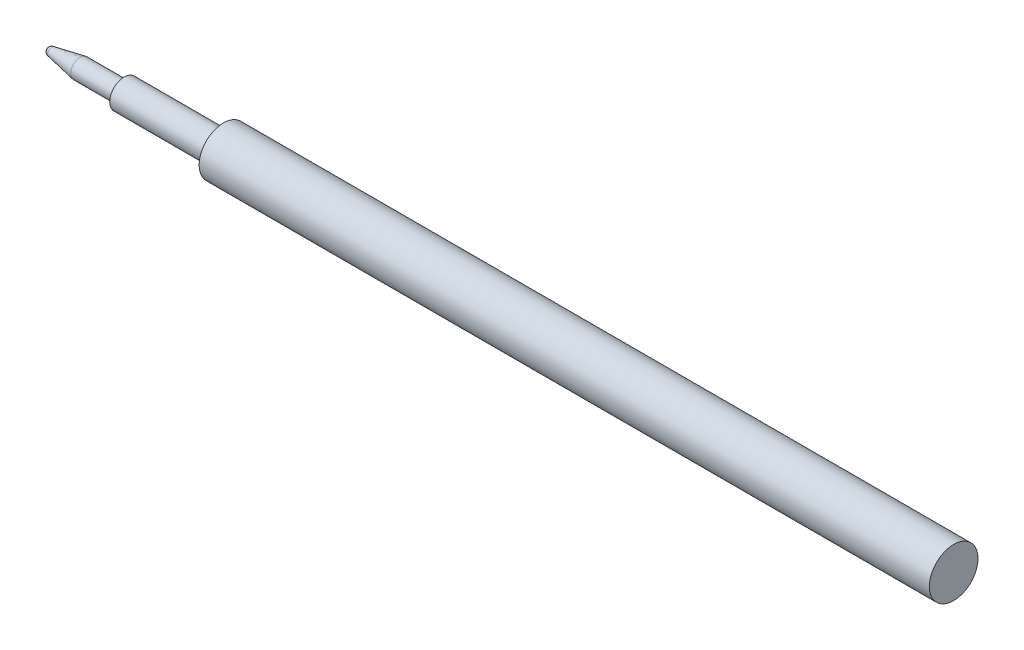
ISO-10303-21;
HEADER;
FILE_DESCRIPTION(('STEP AP214'),'2;1');
FILE_NAME('part.step','',(''),(''),'','','');
FILE_SCHEMA(('AUTOMOTIVE_DESIGN { 1 0 10303 214 1 1 1 1 }'));
ENDSEC;
DATA;
#1=APPLICATION_CONTEXT('core data for automotive mechanical design processes');
#2=APPLICATION_PROTOCOL_DEFINITION('international standard','automotive_design',2000,#1);
#3=PRODUCT_CONTEXT('',#1,'mechanical');
#4=PRODUCT('Part','Part','',(#3));
#5=PRODUCT_RELATED_PRODUCT_CATEGORY('part','',(#4));
#6=PRODUCT_DEFINITION_FORMATION('','',#4);
#7=PRODUCT_DEFINITION_CONTEXT('part definition',#1,'design');
#8=PRODUCT_DEFINITION('design','',#6,#7);
#9=PRODUCT_DEFINITION_SHAPE('','',#8);
#10=(LENGTH_UNIT() NAMED_UNIT(*) SI_UNIT(.MILLI.,.METRE.));
#11=(NAMED_UNIT(*) PLANE_ANGLE_UNIT() SI_UNIT($,.RADIAN.));
#12=(NAMED_UNIT(*) SI_UNIT($,.STERADIAN.) SOLID_ANGLE_UNIT());
#13=UNCERTAINTY_MEASURE_WITH_UNIT(LENGTH_MEASURE(1.E-05),#10,'distance_accuracy_value','');
#14=(GEOMETRIC_REPRESENTATION_CONTEXT(3) GLOBAL_UNCERTAINTY_ASSIGNED_CONTEXT((#13)) GLOBAL_UNIT_ASSIGNED_CONTEXT((#10,
#11,#12)) REPRESENTATION_CONTEXT('',''));
#15=CARTESIAN_POINT('',(0.,0.,0.));
#16=DIRECTION('',(0.,0.,1.));
#17=DIRECTION('',(1.,0.,0.));
#18=AXIS2_PLACEMENT_3D('',#15,#16,#17);
#19=CARTESIAN_POINT('',(0.,0.,0.));
#20=DIRECTION('',(1.,0.,0.));
#21=DIRECTION('',(0.,1.,0.));
#22=AXIS2_PLACEMENT_3D('',#19,#20,#21);
#23=CYLINDRICAL_SURFACE('',#22,1.77);
#24=CARTESIAN_POINT('',(-90.,0.,0.));
#25=DIRECTION('',(1.,0.,0.));
#26=DIRECTION('',(0.,1.,0.));
#27=AXIS2_PLACEMENT_3D('',#24,#25,#26);
#28=CIRCLE('',#27,1.77);
#29=CARTESIAN_POINT('',(-90.,1.77,0.));
#30=VERTEX_POINT('',#29);
#31=EDGE_CURVE('E57',#30,#30,#28,.T.);
#32=ORIENTED_EDGE('',*,*,#31,.F.);
#33=EDGE_LOOP('',(#32));
#34=FACE_BOUND('',#33,.T.);
#35=CARTESIAN_POINT('',(-102.25,0.,0.));
#36=DIRECTION('',(1.,0.,0.));
#37=DIRECTION('',(0.,1.,0.));
#38=AXIS2_PLACEMENT_3D('',#35,#36,#37);
#39=CIRCLE('',#38,1.77);
#40=CARTESIAN_POINT('',(-102.25,1.77,0.));
#41=VERTEX_POINT('',#40);
#42=EDGE_CURVE('E10',#41,#41,#39,.T.);
#43=ORIENTED_EDGE('',*,*,#42,.T.);
#44=EDGE_LOOP('',(#43));
#45=FACE_BOUND('',#44,.T.);
#46=ADVANCED_FACE('F32',(#34,#45),#23,.T.);
#47=CARTESIAN_POINT('',(-102.25,0.,0.));
#48=DIRECTION('',(1.,0.,0.));
#49=DIRECTION('',(0.,1.,0.));
#50=AXIS2_PLACEMENT_3D('',#47,#48,#49);
#51=PLANE('',#50);
#52=ORIENTED_EDGE('',*,*,#42,.F.);
#53=EDGE_LOOP('',(#52));
#54=FACE_BOUND('',#53,.T.);
#55=CARTESIAN_POINT('',(-102.25,0.,0.));
#56=DIRECTION('',(1.,0.,0.));
#57=DIRECTION('',(0.,1.,0.));
#58=AXIS2_PLACEMENT_3D('',#55,#56,#57);
#59=CIRCLE('',#58,1.16);
#60=CARTESIAN_POINT('',(-102.25,1.16,0.));
#61=VERTEX_POINT('',#60);
#62=EDGE_CURVE('E38',#61,#61,#59,.T.);
#63=ORIENTED_EDGE('',*,*,#62,.T.);
#64=EDGE_LOOP('',(#63));
#65=FACE_BOUND('',#64,.T.);
#66=ADVANCED_FACE('F64',(#54,#65),#51,.F.);
#67=CARTESIAN_POINT('',(0.,0.,0.));
#68=DIRECTION('',(1.,0.,0.));
#69=DIRECTION('',(0.,1.,0.));
#70=AXIS2_PLACEMENT_3D('',#67,#68,#69);
#71=CYLINDRICAL_SURFACE('',#70,1.16);
#72=ORIENTED_EDGE('',*,*,#62,.F.);
#73=EDGE_LOOP('',(#72));
#74=FACE_BOUND('',#73,.T.);
#75=CARTESIAN_POINT('',(-107.67,0.,0.));
#76=DIRECTION('',(1.,0.,0.));
#77=DIRECTION('',(0.,1.,0.));
#78=AXIS2_PLACEMENT_3D('',#75,#76,#77);
#79=CIRCLE('',#78,1.16);
#80=CARTESIAN_POINT('',(-107.67,1.16,0.));
#81=VERTEX_POINT('',#80);
#82=EDGE_CURVE('E42',#81,#81,#79,.T.);
#83=ORIENTED_EDGE('',*,*,#82,.T.);
#84=EDGE_LOOP('',(#83));
#85=FACE_BOUND('',#84,.T.);
#86=ADVANCED_FACE('F68',(#74,#85),#71,.T.);
#87=CARTESIAN_POINT('',(-107.67,0.,0.));
#88=DIRECTION('',(1.,0.,0.));
#89=DIRECTION('',(0.,1.,0.));
#90=AXIS2_PLACEMENT_3D('',#87,#88,#89);
#91=CONICAL_SURFACE('',#90,1.16,0.186382789226156);
#92=CARTESIAN_POINT('',(-111.17,0.,0.));
#93=DIRECTION('',(1.,0.,0.));
#94=DIRECTION('',(0.,1.,0.));
#95=AXIS2_PLACEMENT_3D('',#92,#93,#94);
#96=CIRCLE('',#95,0.5);
#97=CARTESIAN_POINT('',(-111.17,0.5,0.));
#98=VERTEX_POINT('',#97);
#99=EDGE_CURVE('E46',#98,#98,#96,.T.);
#100=ORIENTED_EDGE('',*,*,#99,.T.);
#101=EDGE_LOOP('',(#100));
#102=FACE_BOUND('',#101,.T.);
#103=ORIENTED_EDGE('',*,*,#82,.F.);
#104=EDGE_LOOP('',(#103));
#105=FACE_BOUND('',#104,.T.);
#106=ADVANCED_FACE('F73',(#102,#105),#91,.T.);
#107=CARTESIAN_POINT('',(-111.17,0.,0.));
#108=DIRECTION('',(1.,0.,0.));
#109=DIRECTION('',(0.,-1.,0.));
#110=AXIS2_PLACEMENT_3D('',#107,#108,#109);
#111=SPHERICAL_SURFACE('',#110,0.5);
#112=ORIENTED_EDGE('',*,*,#99,.F.);
#113=EDGE_LOOP('',(#112));
#114=FACE_BOUND('',#113,.T.);
#115=ADVANCED_FACE('F79',(#114),#111,.T.);
#116=CARTESIAN_POINT('',(0.,0.,0.));
#117=DIRECTION('',(1.,0.,0.));
#118=DIRECTION('',(0.,1.,0.));
#119=AXIS2_PLACEMENT_3D('',#116,#117,#118);
#120=PLANE('',#119);
#121=CARTESIAN_POINT('',(0.,0.,0.));
#122=DIRECTION('',(1.,0.,0.));
#123=DIRECTION('',(0.,1.,0.));
#124=AXIS2_PLACEMENT_3D('',#121,#122,#123);
#125=CIRCLE('',#124,3.);
#126=CARTESIAN_POINT('',(0.,3.,0.));
#127=VERTEX_POINT('',#126);
#128=EDGE_CURVE('E51',#127,#127,#125,.T.);
#129=ORIENTED_EDGE('',*,*,#128,.T.);
#130=EDGE_LOOP('',(#129));
#131=FACE_BOUND('',#130,.T.);
#132=ADVANCED_FACE('F83',(#131),#120,.T.);
#133=CARTESIAN_POINT('',(0.,0.,0.));
#134=DIRECTION('',(1.,0.,0.));
#135=DIRECTION('',(0.,1.,0.));
#136=AXIS2_PLACEMENT_3D('',#133,#134,#135);
#137=CYLINDRICAL_SURFACE('',#136,2.99999999999999);
#138=CARTESIAN_POINT('',(-90.,0.,0.));
#139=DIRECTION('',(1.,0.,0.));
#140=DIRECTION('',(0.,1.,0.));
#141=AXIS2_PLACEMENT_3D('',#138,#139,#140);
#142=CIRCLE('',#141,2.99999999999999);
#143=CARTESIAN_POINT('',(-90.,2.99999999999999,0.));
#144=VERTEX_POINT('',#143);
#145=EDGE_CURVE('E54',#144,#144,#142,.T.);
#146=ORIENTED_EDGE('',*,*,#145,.T.);
#147=EDGE_LOOP('',(#146));
#148=FACE_BOUND('',#147,.T.);
#149=ORIENTED_EDGE('',*,*,#128,.F.);
#150=EDGE_LOOP('',(#149));
#151=FACE_BOUND('',#150,.T.);
#152=ADVANCED_FACE('F87',(#148,#151),#137,.T.);
#153=CARTESIAN_POINT('',(-90.,0.,0.));
#154=DIRECTION('',(1.,0.,0.));
#155=DIRECTION('',(0.,1.,0.));
#156=AXIS2_PLACEMENT_3D('',#153,#154,#155);
#157=PLANE('',#156);
#158=ORIENTED_EDGE('',*,*,#145,.F.);
#159=EDGE_LOOP('',(#158));
#160=FACE_BOUND('',#159,.T.);
#161=ORIENTED_EDGE('',*,*,#31,.T.);
#162=EDGE_LOOP('',(#161));
#163=FACE_BOUND('',#162,.T.);
#164=ADVANCED_FACE('F61',(#160,#163),#157,.F.);
#165=CLOSED_SHELL('',(#46,#66,#86,#106,#115,#132,#152,#164));
#166=MANIFOLD_SOLID_BREP('B2',#165);
#167=ADVANCED_BREP_SHAPE_REPRESENTATION('',(#18,#166),#14);
#168=SHAPE_DEFINITION_REPRESENTATION(#9,#167);
ENDSEC;
END-ISO-10303-21;
